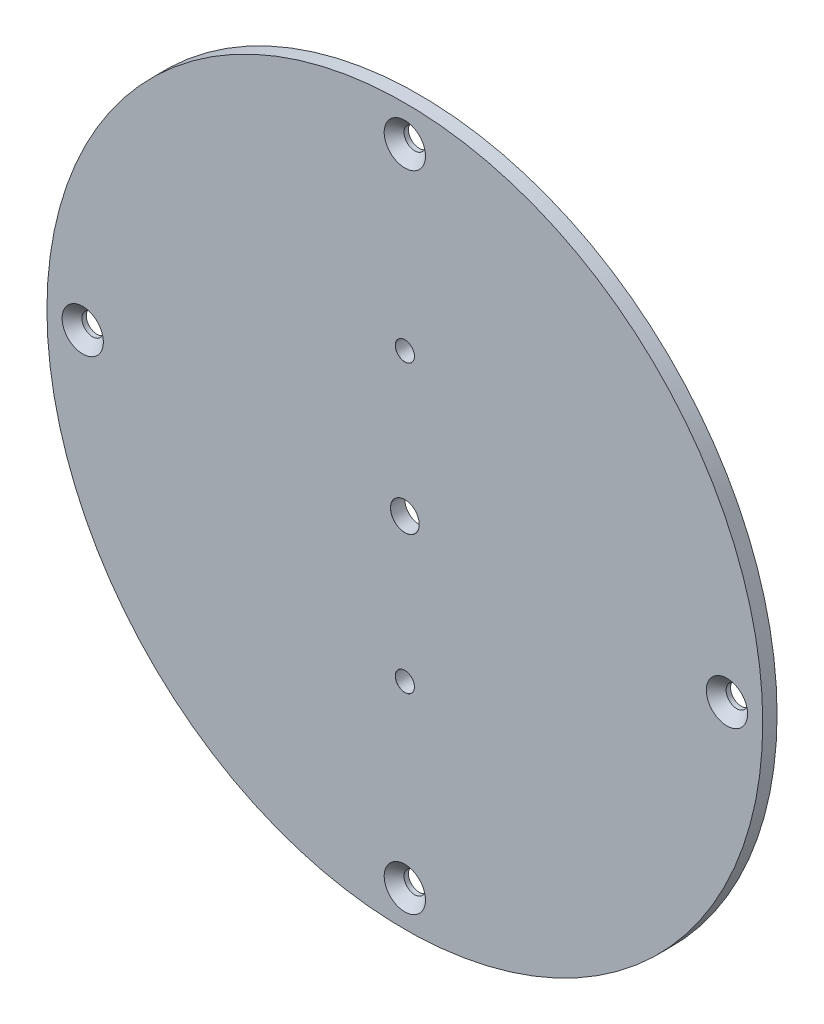
ISO-10303-21;
HEADER;
FILE_DESCRIPTION(('STEP AP214'),'2;1');
FILE_NAME('part.step','',(''),(''),'','','');
FILE_SCHEMA(('AUTOMOTIVE_DESIGN { 1 0 10303 214 1 1 1 1 }'));
ENDSEC;
DATA;
#1=APPLICATION_CONTEXT('core data for automotive mechanical design processes');
#2=APPLICATION_PROTOCOL_DEFINITION('international standard','automotive_design',2000,#1);
#3=PRODUCT_CONTEXT('',#1,'mechanical');
#4=PRODUCT('Part','Part','',(#3));
#5=PRODUCT_RELATED_PRODUCT_CATEGORY('part','',(#4));
#6=PRODUCT_DEFINITION_FORMATION('','',#4);
#7=PRODUCT_DEFINITION_CONTEXT('part definition',#1,'design');
#8=PRODUCT_DEFINITION('design','',#6,#7);
#9=PRODUCT_DEFINITION_SHAPE('','',#8);
#10=(LENGTH_UNIT() NAMED_UNIT(*) SI_UNIT(.MILLI.,.METRE.));
#11=(NAMED_UNIT(*) PLANE_ANGLE_UNIT() SI_UNIT($,.RADIAN.));
#12=(NAMED_UNIT(*) SI_UNIT($,.STERADIAN.) SOLID_ANGLE_UNIT());
#13=UNCERTAINTY_MEASURE_WITH_UNIT(LENGTH_MEASURE(1.E-05),#10,'distance_accuracy_value','');
#14=(GEOMETRIC_REPRESENTATION_CONTEXT(3) GLOBAL_UNCERTAINTY_ASSIGNED_CONTEXT((#13)) GLOBAL_UNIT_ASSIGNED_CONTEXT((#10,
#11,#12)) REPRESENTATION_CONTEXT('',''));
#15=CARTESIAN_POINT('',(0.,0.,0.));
#16=DIRECTION('',(0.,0.,1.));
#17=DIRECTION('',(1.,0.,0.));
#18=AXIS2_PLACEMENT_3D('',#15,#16,#17);
#19=CARTESIAN_POINT('',(0.,0.,6.));
#20=DIRECTION('',(0.,0.,-1.));
#21=DIRECTION('',(-1.,0.,0.));
#22=AXIS2_PLACEMENT_3D('',#19,#20,#21);
#23=CYLINDRICAL_SURFACE('',#22,150.);
#24=CARTESIAN_POINT('',(0.,0.,6.));
#25=DIRECTION('',(0.,0.,1.));
#26=DIRECTION('',(1.,0.,0.));
#27=AXIS2_PLACEMENT_3D('',#24,#25,#26);
#28=CIRCLE('',#27,150.);
#29=CARTESIAN_POINT('',(150.,0.,6.));
#30=VERTEX_POINT('',#29);
#31=EDGE_CURVE('E10',#30,#30,#28,.T.);
#32=ORIENTED_EDGE('',*,*,#31,.F.);
#33=EDGE_LOOP('',(#32));
#34=FACE_BOUND('',#33,.T.);
#35=CARTESIAN_POINT('',(0.,0.,0.));
#36=DIRECTION('',(0.,0.,1.));
#37=DIRECTION('',(1.,0.,0.));
#38=AXIS2_PLACEMENT_3D('',#35,#36,#37);
#39=CIRCLE('',#38,150.);
#40=CARTESIAN_POINT('',(150.,0.,0.));
#41=VERTEX_POINT('',#40);
#42=EDGE_CURVE('E44',#41,#41,#39,.T.);
#43=ORIENTED_EDGE('',*,*,#42,.T.);
#44=EDGE_LOOP('',(#43));
#45=FACE_BOUND('',#44,.T.);
#46=ADVANCED_FACE('F41',(#34,#45),#23,.T.);
#47=CARTESIAN_POINT('',(0.,0.,6.));
#48=DIRECTION('',(0.,0.,1.));
#49=DIRECTION('',(1.,0.,0.));
#50=AXIS2_PLACEMENT_3D('',#47,#48,#49);
#51=PLANE('',#50);
#52=CARTESIAN_POINT('',(0.,135.,6.));
#53=DIRECTION('',(0.,0.,1.));
#54=DIRECTION('',(1.,0.,0.));
#55=AXIS2_PLACEMENT_3D('',#52,#53,#54);
#56=CIRCLE('',#55,8.65);
#57=CARTESIAN_POINT('',(8.65,135.,6.));
#58=VERTEX_POINT('',#57);
#59=EDGE_CURVE('E134',#58,#58,#56,.T.);
#60=ORIENTED_EDGE('',*,*,#59,.F.);
#61=EDGE_LOOP('',(#60));
#62=FACE_BOUND('',#61,.T.);
#63=CARTESIAN_POINT('',(135.000000000004,3.81213167542181E-12,6.));
#64=DIRECTION('',(0.,0.,1.));
#65=DIRECTION('',(1.,0.,0.));
#66=AXIS2_PLACEMENT_3D('',#63,#64,#65);
#67=CIRCLE('',#66,8.64999999999999);
#68=CARTESIAN_POINT('',(143.650000000004,3.81213167542181E-12,6.));
#69=VERTEX_POINT('',#68);
#70=EDGE_CURVE('E122',#69,#69,#67,.T.);
#71=ORIENTED_EDGE('',*,*,#70,.F.);
#72=EDGE_LOOP('',(#71));
#73=FACE_BOUND('',#72,.T.);
#74=CARTESIAN_POINT('',(7.62426335084362E-12,-135.,6.));
#75=DIRECTION('',(0.,0.,1.));
#76=DIRECTION('',(1.,0.,0.));
#77=AXIS2_PLACEMENT_3D('',#74,#75,#76);
#78=CIRCLE('',#77,8.65);
#79=CARTESIAN_POINT('',(8.65000000000762,-135.,6.));
#80=VERTEX_POINT('',#79);
#81=EDGE_CURVE('E110',#80,#80,#78,.T.);
#82=ORIENTED_EDGE('',*,*,#81,.F.);
#83=EDGE_LOOP('',(#82));
#84=FACE_BOUND('',#83,.T.);
#85=CARTESIAN_POINT('',(-134.999999999996,-3.79559894363332E-12,6.));
#86=DIRECTION('',(0.,0.,1.));
#87=DIRECTION('',(1.,0.,0.));
#88=AXIS2_PLACEMENT_3D('',#85,#86,#87);
#89=CIRCLE('',#88,8.64999999999999);
#90=CARTESIAN_POINT('',(-126.349999999996,-3.79559894363332E-12,6.));
#91=VERTEX_POINT('',#90);
#92=EDGE_CURVE('E98',#91,#91,#89,.T.);
#93=ORIENTED_EDGE('',*,*,#92,.F.);
#94=EDGE_LOOP('',(#93));
#95=FACE_BOUND('',#94,.T.);
#96=CARTESIAN_POINT('',(0.,0.,6.));
#97=DIRECTION('',(0.,0.,1.));
#98=DIRECTION('',(1.,0.,0.));
#99=AXIS2_PLACEMENT_3D('',#96,#97,#98);
#100=CIRCLE('',#99,6.025);
#101=CARTESIAN_POINT('',(6.025,0.,6.));
#102=VERTEX_POINT('',#101);
#103=EDGE_CURVE('E86',#102,#102,#100,.T.);
#104=ORIENTED_EDGE('',*,*,#103,.F.);
#105=EDGE_LOOP('',(#104));
#106=FACE_BOUND('',#105,.T.);
#107=CARTESIAN_POINT('',(0.,60.,6.));
#108=DIRECTION('',(0.,0.,1.));
#109=DIRECTION('',(1.,0.,0.));
#110=AXIS2_PLACEMENT_3D('',#107,#108,#109);
#111=CIRCLE('',#110,4.025);
#112=CARTESIAN_POINT('',(4.025,60.,6.));
#113=VERTEX_POINT('',#112);
#114=EDGE_CURVE('E74',#113,#113,#111,.T.);
#115=ORIENTED_EDGE('',*,*,#114,.F.);
#116=EDGE_LOOP('',(#115));
#117=FACE_BOUND('',#116,.T.);
#118=CARTESIAN_POINT('',(0.,-60.,6.));
#119=DIRECTION('',(0.,0.,1.));
#120=DIRECTION('',(1.,0.,0.));
#121=AXIS2_PLACEMENT_3D('',#118,#119,#120);
#122=CIRCLE('',#121,4.025);
#123=CARTESIAN_POINT('',(4.025,-60.,6.));
#124=VERTEX_POINT('',#123);
#125=EDGE_CURVE('E62',#124,#124,#122,.T.);
#126=ORIENTED_EDGE('',*,*,#125,.F.);
#127=EDGE_LOOP('',(#126));
#128=FACE_BOUND('',#127,.T.);
#129=ORIENTED_EDGE('',*,*,#31,.T.);
#130=EDGE_LOOP('',(#129));
#131=FACE_BOUND('',#130,.T.);
#132=ADVANCED_FACE('F141',(#62,#73,#84,#95,#106,#117,#128,#131),#51,.T.);
#133=CARTESIAN_POINT('',(0.,0.,0.));
#134=DIRECTION('',(0.,0.,1.));
#135=DIRECTION('',(1.,0.,0.));
#136=AXIS2_PLACEMENT_3D('',#133,#134,#135);
#137=PLANE('',#136);
#138=CARTESIAN_POINT('',(0.,135.,0.));
#139=DIRECTION('',(0.,0.,1.));
#140=DIRECTION('',(1.,0.,0.));
#141=AXIS2_PLACEMENT_3D('',#138,#139,#140);
#142=CIRCLE('',#141,4.5);
#143=CARTESIAN_POINT('',(4.5,135.,0.));
#144=VERTEX_POINT('',#143);
#145=EDGE_CURVE('E126',#144,#144,#142,.T.);
#146=ORIENTED_EDGE('',*,*,#145,.T.);
#147=EDGE_LOOP('',(#146));
#148=FACE_BOUND('',#147,.T.);
#149=CARTESIAN_POINT('',(135.000000000004,3.81213167542181E-12,0.));
#150=DIRECTION('',(0.,0.,1.));
#151=DIRECTION('',(1.,0.,0.));
#152=AXIS2_PLACEMENT_3D('',#149,#150,#151);
#153=CIRCLE('',#152,4.5);
#154=CARTESIAN_POINT('',(139.500000000004,3.81213167542181E-12,0.));
#155=VERTEX_POINT('',#154);
#156=EDGE_CURVE('E114',#155,#155,#153,.T.);
#157=ORIENTED_EDGE('',*,*,#156,.T.);
#158=EDGE_LOOP('',(#157));
#159=FACE_BOUND('',#158,.T.);
#160=CARTESIAN_POINT('',(7.62426335084362E-12,-135.,0.));
#161=DIRECTION('',(0.,0.,1.));
#162=DIRECTION('',(1.,0.,0.));
#163=AXIS2_PLACEMENT_3D('',#160,#161,#162);
#164=CIRCLE('',#163,4.5);
#165=CARTESIAN_POINT('',(4.50000000000762,-135.,0.));
#166=VERTEX_POINT('',#165);
#167=EDGE_CURVE('E102',#166,#166,#164,.T.);
#168=ORIENTED_EDGE('',*,*,#167,.T.);
#169=EDGE_LOOP('',(#168));
#170=FACE_BOUND('',#169,.T.);
#171=CARTESIAN_POINT('',(-134.999999999996,-3.79559894363332E-12,0.));
#172=DIRECTION('',(0.,0.,1.));
#173=DIRECTION('',(1.,0.,0.));
#174=AXIS2_PLACEMENT_3D('',#171,#172,#173);
#175=CIRCLE('',#174,4.5);
#176=CARTESIAN_POINT('',(-130.499999999996,-3.79559894363332E-12,0.));
#177=VERTEX_POINT('',#176);
#178=EDGE_CURVE('E90',#177,#177,#175,.T.);
#179=ORIENTED_EDGE('',*,*,#178,.T.);
#180=EDGE_LOOP('',(#179));
#181=FACE_BOUND('',#180,.T.);
#182=CARTESIAN_POINT('',(0.,0.,0.));
#183=DIRECTION('',(0.,0.,1.));
#184=DIRECTION('',(1.,0.,0.));
#185=AXIS2_PLACEMENT_3D('',#182,#183,#184);
#186=CIRCLE('',#185,6.);
#187=CARTESIAN_POINT('',(6.,0.,0.));
#188=VERTEX_POINT('',#187);
#189=EDGE_CURVE('E78',#188,#188,#186,.T.);
#190=ORIENTED_EDGE('',*,*,#189,.T.);
#191=EDGE_LOOP('',(#190));
#192=FACE_BOUND('',#191,.T.);
#193=CARTESIAN_POINT('',(0.,60.,0.));
#194=DIRECTION('',(0.,0.,1.));
#195=DIRECTION('',(1.,0.,0.));
#196=AXIS2_PLACEMENT_3D('',#193,#194,#195);
#197=CIRCLE('',#196,4.);
#198=CARTESIAN_POINT('',(4.,60.,0.));
#199=VERTEX_POINT('',#198);
#200=EDGE_CURVE('E66',#199,#199,#197,.T.);
#201=ORIENTED_EDGE('',*,*,#200,.T.);
#202=EDGE_LOOP('',(#201));
#203=FACE_BOUND('',#202,.T.);
#204=CARTESIAN_POINT('',(0.,-60.,0.));
#205=DIRECTION('',(0.,0.,1.));
#206=DIRECTION('',(1.,0.,0.));
#207=AXIS2_PLACEMENT_3D('',#204,#205,#206);
#208=CIRCLE('',#207,4.);
#209=CARTESIAN_POINT('',(4.,-60.,0.));
#210=VERTEX_POINT('',#209);
#211=EDGE_CURVE('E53',#210,#210,#208,.T.);
#212=ORIENTED_EDGE('',*,*,#211,.T.);
#213=EDGE_LOOP('',(#212));
#214=FACE_BOUND('',#213,.T.);
#215=ORIENTED_EDGE('',*,*,#42,.F.);
#216=EDGE_LOOP('',(#215));
#217=FACE_BOUND('',#216,.T.);
#218=ADVANCED_FACE('F144',(#148,#159,#170,#181,#192,#203,#214,#217),#137,.F.);
#219=CARTESIAN_POINT('',(0.,-60.,6.));
#220=DIRECTION('',(0.,0.,1.));
#221=DIRECTION('',(1.,0.,0.));
#222=AXIS2_PLACEMENT_3D('',#219,#220,#221);
#223=CYLINDRICAL_SURFACE('',#222,4.);
#224=ORIENTED_EDGE('',*,*,#211,.F.);
#225=EDGE_LOOP('',(#224));
#226=FACE_BOUND('',#225,.T.);
#227=CARTESIAN_POINT('',(0.,-60.,5.975));
#228=DIRECTION('',(0.,0.,1.));
#229=DIRECTION('',(1.,0.,0.));
#230=AXIS2_PLACEMENT_3D('',#227,#228,#229);
#231=CIRCLE('',#230,4.);
#232=CARTESIAN_POINT('',(4.,-60.,5.975));
#233=VERTEX_POINT('',#232);
#234=EDGE_CURVE('E58',#233,#233,#231,.T.);
#235=ORIENTED_EDGE('',*,*,#234,.T.);
#236=EDGE_LOOP('',(#235));
#237=FACE_BOUND('',#236,.T.);
#238=ADVANCED_FACE('F161',(#226,#237),#223,.F.);
#239=CARTESIAN_POINT('',(0.,-60.,6.));
#240=DIRECTION('',(0.,0.,1.));
#241=DIRECTION('',(1.,0.,0.));
#242=AXIS2_PLACEMENT_3D('',#239,#240,#241);
#243=CONICAL_SURFACE('',#242,4.025,0.785398163397414);
#244=ORIENTED_EDGE('',*,*,#234,.F.);
#245=EDGE_LOOP('',(#244));
#246=FACE_BOUND('',#245,.T.);
#247=ORIENTED_EDGE('',*,*,#125,.T.);
#248=EDGE_LOOP('',(#247));
#249=FACE_BOUND('',#248,.T.);
#250=ADVANCED_FACE('F158',(#246,#249),#243,.F.);
#251=CARTESIAN_POINT('',(0.,60.,6.));
#252=DIRECTION('',(0.,0.,1.));
#253=DIRECTION('',(1.,0.,0.));
#254=AXIS2_PLACEMENT_3D('',#251,#252,#253);
#255=CYLINDRICAL_SURFACE('',#254,4.);
#256=ORIENTED_EDGE('',*,*,#200,.F.);
#257=EDGE_LOOP('',(#256));
#258=FACE_BOUND('',#257,.T.);
#259=CARTESIAN_POINT('',(0.,60.,5.975));
#260=DIRECTION('',(0.,0.,1.));
#261=DIRECTION('',(1.,0.,0.));
#262=AXIS2_PLACEMENT_3D('',#259,#260,#261);
#263=CIRCLE('',#262,4.);
#264=CARTESIAN_POINT('',(4.,60.,5.975));
#265=VERTEX_POINT('',#264);
#266=EDGE_CURVE('E70',#265,#265,#263,.T.);
#267=ORIENTED_EDGE('',*,*,#266,.T.);
#268=EDGE_LOOP('',(#267));
#269=FACE_BOUND('',#268,.T.);
#270=ADVANCED_FACE('F160',(#258,#269),#255,.F.);
#271=CARTESIAN_POINT('',(0.,60.,6.));
#272=DIRECTION('',(0.,0.,1.));
#273=DIRECTION('',(1.,0.,0.));
#274=AXIS2_PLACEMENT_3D('',#271,#272,#273);
#275=CONICAL_SURFACE('',#274,4.025,0.785398163397414);
#276=ORIENTED_EDGE('',*,*,#266,.F.);
#277=EDGE_LOOP('',(#276));
#278=FACE_BOUND('',#277,.T.);
#279=ORIENTED_EDGE('',*,*,#114,.T.);
#280=EDGE_LOOP('',(#279));
#281=FACE_BOUND('',#280,.T.);
#282=ADVANCED_FACE('F168',(#278,#281),#275,.F.);
#283=CARTESIAN_POINT('',(0.,0.,6.));
#284=DIRECTION('',(0.,0.,1.));
#285=DIRECTION('',(1.,0.,0.));
#286=AXIS2_PLACEMENT_3D('',#283,#284,#285);
#287=CYLINDRICAL_SURFACE('',#286,6.);
#288=ORIENTED_EDGE('',*,*,#189,.F.);
#289=EDGE_LOOP('',(#288));
#290=FACE_BOUND('',#289,.T.);
#291=CARTESIAN_POINT('',(0.,0.,5.975));
#292=DIRECTION('',(0.,0.,1.));
#293=DIRECTION('',(1.,0.,0.));
#294=AXIS2_PLACEMENT_3D('',#291,#292,#293);
#295=CIRCLE('',#294,6.);
#296=CARTESIAN_POINT('',(6.,0.,5.975));
#297=VERTEX_POINT('',#296);
#298=EDGE_CURVE('E82',#297,#297,#295,.T.);
#299=ORIENTED_EDGE('',*,*,#298,.T.);
#300=EDGE_LOOP('',(#299));
#301=FACE_BOUND('',#300,.T.);
#302=ADVANCED_FACE('F204',(#290,#301),#287,.F.);
#303=CARTESIAN_POINT('',(0.,0.,6.));
#304=DIRECTION('',(0.,0.,1.));
#305=DIRECTION('',(1.,0.,0.));
#306=AXIS2_PLACEMENT_3D('',#303,#304,#305);
#307=CONICAL_SURFACE('',#306,6.025,0.785398163397466);
#308=ORIENTED_EDGE('',*,*,#298,.F.);
#309=EDGE_LOOP('',(#308));
#310=FACE_BOUND('',#309,.T.);
#311=ORIENTED_EDGE('',*,*,#103,.T.);
#312=EDGE_LOOP('',(#311));
#313=FACE_BOUND('',#312,.T.);
#314=ADVANCED_FACE('F209',(#310,#313),#307,.F.);
#315=CARTESIAN_POINT('',(-134.999999999996,-3.79559894363332E-12,6.));
#316=DIRECTION('',(0.,0.,1.));
#317=DIRECTION('',(1.,0.,0.));
#318=AXIS2_PLACEMENT_3D('',#315,#316,#317);
#319=CYLINDRICAL_SURFACE('',#318,4.5);
#320=ORIENTED_EDGE('',*,*,#178,.F.);
#321=EDGE_LOOP('',(#320));
#322=FACE_BOUND('',#321,.T.);
#323=CARTESIAN_POINT('',(-134.999999999996,-3.79559894363332E-12,1.85));
#324=DIRECTION('',(0.,0.,1.));
#325=DIRECTION('',(1.,0.,0.));
#326=AXIS2_PLACEMENT_3D('',#323,#324,#325);
#327=CIRCLE('',#326,4.5);
#328=CARTESIAN_POINT('',(-130.499999999996,-3.79559894363332E-12,1.85));
#329=VERTEX_POINT('',#328);
#330=EDGE_CURVE('E94',#329,#329,#327,.T.);
#331=ORIENTED_EDGE('',*,*,#330,.T.);
#332=EDGE_LOOP('',(#331));
#333=FACE_BOUND('',#332,.T.);
#334=ADVANCED_FACE('F215',(#322,#333),#319,.F.);
#335=CARTESIAN_POINT('',(-134.999999999996,-3.79559894363332E-12,6.));
#336=DIRECTION('',(0.,0.,1.));
#337=DIRECTION('',(1.,0.,0.));
#338=AXIS2_PLACEMENT_3D('',#335,#336,#337);
#339=CONICAL_SURFACE('',#338,8.64999999999999,0.785398163397447);
#340=ORIENTED_EDGE('',*,*,#330,.F.);
#341=EDGE_LOOP('',(#340));
#342=FACE_BOUND('',#341,.T.);
#343=ORIENTED_EDGE('',*,*,#92,.T.);
#344=EDGE_LOOP('',(#343));
#345=FACE_BOUND('',#344,.T.);
#346=ADVANCED_FACE('F219',(#342,#345),#339,.F.);
#347=CARTESIAN_POINT('',(7.62426335084362E-12,-135.,6.));
#348=DIRECTION('',(0.,0.,1.));
#349=DIRECTION('',(1.,0.,0.));
#350=AXIS2_PLACEMENT_3D('',#347,#348,#349);
#351=CYLINDRICAL_SURFACE('',#350,4.5);
#352=ORIENTED_EDGE('',*,*,#167,.F.);
#353=EDGE_LOOP('',(#352));
#354=FACE_BOUND('',#353,.T.);
#355=CARTESIAN_POINT('',(7.62426335084362E-12,-135.,1.85));
#356=DIRECTION('',(0.,0.,1.));
#357=DIRECTION('',(1.,0.,0.));
#358=AXIS2_PLACEMENT_3D('',#355,#356,#357);
#359=CIRCLE('',#358,4.5);
#360=CARTESIAN_POINT('',(4.50000000000762,-135.,1.85));
#361=VERTEX_POINT('',#360);
#362=EDGE_CURVE('E106',#361,#361,#359,.T.);
#363=ORIENTED_EDGE('',*,*,#362,.T.);
#364=EDGE_LOOP('',(#363));
#365=FACE_BOUND('',#364,.T.);
#366=ADVANCED_FACE('F223',(#354,#365),#351,.F.);
#367=CARTESIAN_POINT('',(7.62426335084362E-12,-135.,6.));
#368=DIRECTION('',(0.,0.,1.));
#369=DIRECTION('',(1.,0.,0.));
#370=AXIS2_PLACEMENT_3D('',#367,#368,#369);
#371=CONICAL_SURFACE('',#370,8.65,0.785398163397449);
#372=ORIENTED_EDGE('',*,*,#362,.F.);
#373=EDGE_LOOP('',(#372));
#374=FACE_BOUND('',#373,.T.);
#375=ORIENTED_EDGE('',*,*,#81,.T.);
#376=EDGE_LOOP('',(#375));
#377=FACE_BOUND('',#376,.T.);
#378=ADVANCED_FACE('F227',(#374,#377),#371,.F.);
#379=CARTESIAN_POINT('',(135.000000000004,3.81213167542181E-12,6.));
#380=DIRECTION('',(0.,0.,1.));
#381=DIRECTION('',(1.,0.,0.));
#382=AXIS2_PLACEMENT_3D('',#379,#380,#381);
#383=CYLINDRICAL_SURFACE('',#382,4.5);
#384=ORIENTED_EDGE('',*,*,#156,.F.);
#385=EDGE_LOOP('',(#384));
#386=FACE_BOUND('',#385,.T.);
#387=CARTESIAN_POINT('',(135.000000000004,3.81213167542181E-12,1.85));
#388=DIRECTION('',(0.,0.,1.));
#389=DIRECTION('',(1.,0.,0.));
#390=AXIS2_PLACEMENT_3D('',#387,#388,#389);
#391=CIRCLE('',#390,4.5);
#392=CARTESIAN_POINT('',(139.500000000004,3.81213167542181E-12,1.85));
#393=VERTEX_POINT('',#392);
#394=EDGE_CURVE('E118',#393,#393,#391,.T.);
#395=ORIENTED_EDGE('',*,*,#394,.T.);
#396=EDGE_LOOP('',(#395));
#397=FACE_BOUND('',#396,.T.);
#398=ADVANCED_FACE('F231',(#386,#397),#383,.F.);
#399=CARTESIAN_POINT('',(135.000000000004,3.81213167542181E-12,6.));
#400=DIRECTION('',(0.,0.,1.));
#401=DIRECTION('',(1.,0.,0.));
#402=AXIS2_PLACEMENT_3D('',#399,#400,#401);
#403=CONICAL_SURFACE('',#402,8.64999999999999,0.785398163397447);
#404=ORIENTED_EDGE('',*,*,#394,.F.);
#405=EDGE_LOOP('',(#404));
#406=FACE_BOUND('',#405,.T.);
#407=ORIENTED_EDGE('',*,*,#70,.T.);
#408=EDGE_LOOP('',(#407));
#409=FACE_BOUND('',#408,.T.);
#410=ADVANCED_FACE('F235',(#406,#409),#403,.F.);
#411=CARTESIAN_POINT('',(0.,135.,6.));
#412=DIRECTION('',(0.,0.,1.));
#413=DIRECTION('',(1.,0.,0.));
#414=AXIS2_PLACEMENT_3D('',#411,#412,#413);
#415=CYLINDRICAL_SURFACE('',#414,4.5);
#416=ORIENTED_EDGE('',*,*,#145,.F.);
#417=EDGE_LOOP('',(#416));
#418=FACE_BOUND('',#417,.T.);
#419=CARTESIAN_POINT('',(0.,135.,1.85));
#420=DIRECTION('',(0.,0.,1.));
#421=DIRECTION('',(1.,0.,0.));
#422=AXIS2_PLACEMENT_3D('',#419,#420,#421);
#423=CIRCLE('',#422,4.5);
#424=CARTESIAN_POINT('',(4.5,135.,1.85));
#425=VERTEX_POINT('',#424);
#426=EDGE_CURVE('E130',#425,#425,#423,.T.);
#427=ORIENTED_EDGE('',*,*,#426,.T.);
#428=EDGE_LOOP('',(#427));
#429=FACE_BOUND('',#428,.T.);
#430=ADVANCED_FACE('F239',(#418,#429),#415,.F.);
#431=CARTESIAN_POINT('',(0.,135.,6.));
#432=DIRECTION('',(0.,0.,1.));
#433=DIRECTION('',(1.,0.,0.));
#434=AXIS2_PLACEMENT_3D('',#431,#432,#433);
#435=CONICAL_SURFACE('',#434,8.65,0.785398163397449);
#436=ORIENTED_EDGE('',*,*,#426,.F.);
#437=EDGE_LOOP('',(#436));
#438=FACE_BOUND('',#437,.T.);
#439=ORIENTED_EDGE('',*,*,#59,.T.);
#440=EDGE_LOOP('',(#439));
#441=FACE_BOUND('',#440,.T.);
#442=ADVANCED_FACE('F139',(#438,#441),#435,.F.);
#443=CLOSED_SHELL('',(#46,#132,#218,#238,#250,#270,#282,#302,#314,#334,#346,#366,#378,#398,#410,
#430,#442));
#444=MANIFOLD_SOLID_BREP('B2',#443);
#445=ADVANCED_BREP_SHAPE_REPRESENTATION('',(#18,#444),#14);
#446=SHAPE_DEFINITION_REPRESENTATION(#9,#445);
ENDSEC;
END-ISO-10303-21;
